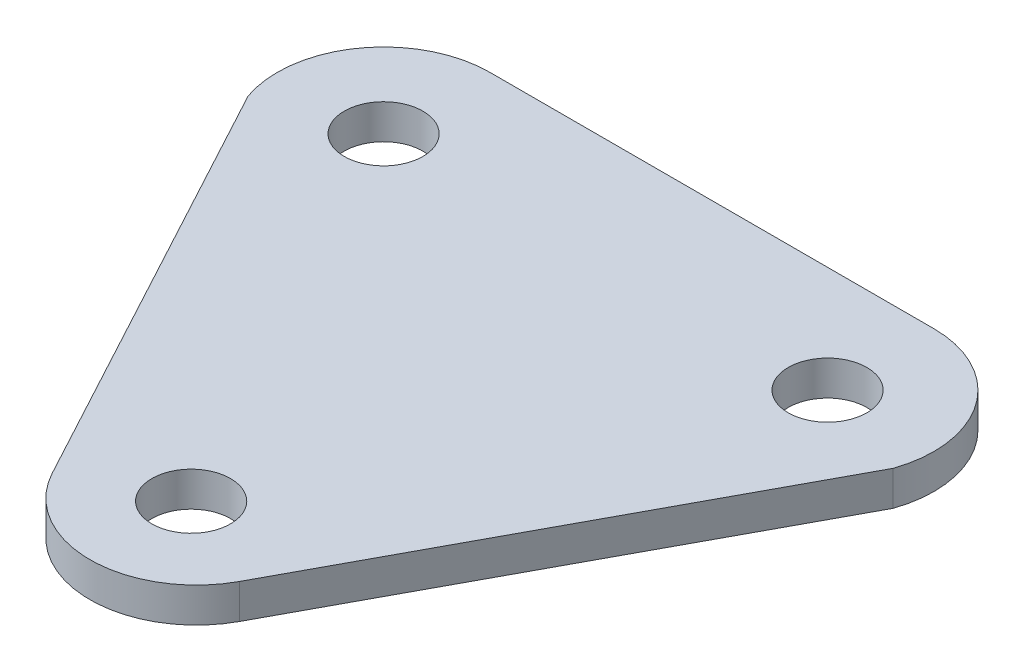
ISO-10303-21;
HEADER;
FILE_DESCRIPTION(('STEP AP214'),'2;1');
FILE_NAME('part.step','',(''),(''),'','','');
FILE_SCHEMA(('AUTOMOTIVE_DESIGN { 1 0 10303 214 1 1 1 1 }'));
ENDSEC;
DATA;
#1=APPLICATION_CONTEXT('core data for automotive mechanical design processes');
#2=APPLICATION_PROTOCOL_DEFINITION('international standard','automotive_design',2000,#1);
#3=PRODUCT_CONTEXT('',#1,'mechanical');
#4=PRODUCT('Part','Part','',(#3));
#5=PRODUCT_RELATED_PRODUCT_CATEGORY('part','',(#4));
#6=PRODUCT_DEFINITION_FORMATION('','',#4);
#7=PRODUCT_DEFINITION_CONTEXT('part definition',#1,'design');
#8=PRODUCT_DEFINITION('design','',#6,#7);
#9=PRODUCT_DEFINITION_SHAPE('','',#8);
#10=(LENGTH_UNIT() NAMED_UNIT(*) SI_UNIT(.MILLI.,.METRE.));
#11=(NAMED_UNIT(*) PLANE_ANGLE_UNIT() SI_UNIT($,.RADIAN.));
#12=(NAMED_UNIT(*) SI_UNIT($,.STERADIAN.) SOLID_ANGLE_UNIT());
#13=UNCERTAINTY_MEASURE_WITH_UNIT(LENGTH_MEASURE(1.E-05),#10,'distance_accuracy_value','');
#14=(GEOMETRIC_REPRESENTATION_CONTEXT(3) GLOBAL_UNCERTAINTY_ASSIGNED_CONTEXT((#13)) GLOBAL_UNIT_ASSIGNED_CONTEXT((#10,
#11,#12)) REPRESENTATION_CONTEXT('',''));
#15=CARTESIAN_POINT('',(0.,0.,0.));
#16=DIRECTION('',(0.,0.,1.));
#17=DIRECTION('',(1.,0.,0.));
#18=AXIS2_PLACEMENT_3D('',#15,#16,#17);
#19=CARTESIAN_POINT('',(0.,7.5,-61.0594186176359));
#20=DIRECTION('',(0.,0.,-1.));
#21=DIRECTION('',(-1.,0.,0.));
#22=AXIS2_PLACEMENT_3D('',#19,#20,#21);
#23=PLANE('',#22);
#24=DIRECTION('',(1.,0.,0.));
#25=VECTOR('',#24,1.);
#26=CARTESIAN_POINT('',(0.,0.,-61.0594186176359));
#27=LINE('',#26,#25);
#28=CARTESIAN_POINT('',(-48.0000000000001,0.,-61.0594186176359));
#29=VERTEX_POINT('',#28);
#30=CARTESIAN_POINT('',(48.,0.,-61.059418617636));
#31=VERTEX_POINT('',#30);
#32=EDGE_CURVE('E145',#29,#31,#27,.T.);
#33=ORIENTED_EDGE('',*,*,#32,.F.);
#34=DIRECTION('',(0.,-1.,0.));
#35=VECTOR('',#34,1.);
#36=CARTESIAN_POINT('',(-48.0000000000001,7.5,-61.0594186176359));
#37=LINE('',#36,#35);
#38=CARTESIAN_POINT('',(-48.0000000000001,7.5,-61.0594186176359));
#39=VERTEX_POINT('',#38);
#40=EDGE_CURVE('E11',#39,#29,#37,.T.);
#41=ORIENTED_EDGE('',*,*,#40,.F.);
#42=DIRECTION('',(1.,0.,0.));
#43=VECTOR('',#42,1.);
#44=CARTESIAN_POINT('',(0.,7.5,-61.0594186176359));
#45=LINE('',#44,#43);
#46=CARTESIAN_POINT('',(48.,7.5,-61.059418617636));
#47=VERTEX_POINT('',#46);
#48=EDGE_CURVE('E323',#39,#47,#45,.T.);
#49=ORIENTED_EDGE('',*,*,#48,.T.);
#50=DIRECTION('',(0.,-1.,0.));
#51=VECTOR('',#50,1.);
#52=CARTESIAN_POINT('',(48.,7.5,-61.059418617636));
#53=LINE('',#52,#51);
#54=EDGE_CURVE('E63',#47,#31,#53,.T.);
#55=ORIENTED_EDGE('',*,*,#54,.T.);
#56=EDGE_LOOP('',(#33,#41,#49,#55));
#57=FACE_BOUND('',#56,.T.);
#58=ADVANCED_FACE('F45',(#57),#23,.T.);
#59=CARTESIAN_POINT('',(-48.,7.5,-38.0594186176359));
#60=DIRECTION('',(0.,-1.,0.));
#61=DIRECTION('',(0.,0.,-1.));
#62=AXIS2_PLACEMENT_3D('',#59,#60,#61);
#63=CYLINDRICAL_SURFACE('',#62,23.);
#64=CARTESIAN_POINT('',(-48.,0.,-38.0594186176359));
#65=DIRECTION('',(0.,1.,0.));
#66=DIRECTION('',(0.,0.,1.));
#67=AXIS2_PLACEMENT_3D('',#64,#65,#66);
#68=CIRCLE('',#67,23.);
#69=CARTESIAN_POINT('',(-69.7230420316021,0.,-30.5023394931824));
#70=VERTEX_POINT('',#69);
#71=EDGE_CURVE('E148',#29,#70,#68,.T.);
#72=ORIENTED_EDGE('',*,*,#71,.T.);
#73=DIRECTION('',(0.,-1.,0.));
#74=VECTOR('',#73,1.);
#75=CARTESIAN_POINT('',(-69.7230420316021,7.5,-30.5023394931824));
#76=LINE('',#75,#74);
#77=CARTESIAN_POINT('',(-69.7230420316021,7.5,-30.5023394931824));
#78=VERTEX_POINT('',#77);
#79=EDGE_CURVE('E55',#78,#70,#76,.T.);
#80=ORIENTED_EDGE('',*,*,#79,.F.);
#81=CARTESIAN_POINT('',(-48.,7.5,-38.0594186176359));
#82=DIRECTION('',(0.,1.,0.));
#83=DIRECTION('',(0.,0.,1.));
#84=AXIS2_PLACEMENT_3D('',#81,#82,#83);
#85=CIRCLE('',#84,23.);
#86=EDGE_CURVE('E327',#39,#78,#85,.T.);
#87=ORIENTED_EDGE('',*,*,#86,.F.);
#88=ORIENTED_EDGE('',*,*,#40,.T.);
#89=EDGE_LOOP('',(#72,#80,#87,#88));
#90=FACE_BOUND('',#89,.T.);
#91=ADVANCED_FACE('F182',(#90),#63,.T.);
#92=CARTESIAN_POINT('',(-41.308585094542,7.5,22.2502861043366));
#93=DIRECTION('',(0.880407019554408,0.,-0.474218810170289));
#94=DIRECTION('',(-0.474218810170289,0.,-0.880407019554408));
#95=AXIS2_PLACEMENT_3D('',#92,#93,#94);
#96=PLANE('',#95);
#97=DIRECTION('',(0.474218810170289,0.,0.880407019554408));
#98=VECTOR('',#97,1.);
#99=CARTESIAN_POINT('',(-41.308585094542,0.,22.2502861043366));
#100=LINE('',#99,#98);
#101=CARTESIAN_POINT('',(-20.2493614497514,0.,61.3476140162807));
#102=VERTEX_POINT('',#101);
#103=EDGE_CURVE('E152',#70,#102,#100,.T.);
#104=ORIENTED_EDGE('',*,*,#103,.T.);
#105=DIRECTION('',(0.,-1.,0.));
#106=VECTOR('',#105,1.);
#107=CARTESIAN_POINT('',(-20.2493614497514,7.5,61.3476140162807));
#108=LINE('',#107,#106);
#109=CARTESIAN_POINT('',(-20.2493614497514,7.5,61.3476140162807));
#110=VERTEX_POINT('',#109);
#111=EDGE_CURVE('E111',#110,#102,#108,.T.);
#112=ORIENTED_EDGE('',*,*,#111,.F.);
#113=DIRECTION('',(0.474218810170289,0.,0.880407019554408));
#114=VECTOR('',#113,1.);
#115=CARTESIAN_POINT('',(-41.308585094542,7.5,22.2502861043366));
#116=LINE('',#115,#114);
#117=EDGE_CURVE('E121',#78,#110,#116,.T.);
#118=ORIENTED_EDGE('',*,*,#117,.F.);
#119=ORIENTED_EDGE('',*,*,#79,.T.);
#120=EDGE_LOOP('',(#104,#112,#118,#119));
#121=FACE_BOUND('',#120,.T.);
#122=ADVANCED_FACE('F179',(#121),#96,.F.);
#123=CARTESIAN_POINT('',(0.,7.5,50.440581382364));
#124=DIRECTION('',(0.,-1.,0.));
#125=DIRECTION('',(0.,0.,-1.));
#126=AXIS2_PLACEMENT_3D('',#123,#124,#125);
#127=CYLINDRICAL_SURFACE('',#126,23.);
#128=CARTESIAN_POINT('',(0.,0.,50.440581382364));
#129=DIRECTION('',(0.,1.,0.));
#130=DIRECTION('',(0.,0.,1.));
#131=AXIS2_PLACEMENT_3D('',#128,#129,#130);
#132=CIRCLE('',#131,23.);
#133=CARTESIAN_POINT('',(20.2493614497514,0.,61.3476140162807));
#134=VERTEX_POINT('',#133);
#135=EDGE_CURVE('E106',#134,#102,#132,.F.);
#136=ORIENTED_EDGE('',*,*,#135,.F.);
#137=DIRECTION('',(0.,-1.,0.));
#138=VECTOR('',#137,1.);
#139=CARTESIAN_POINT('',(20.2493614497514,7.5,61.3476140162807));
#140=LINE('',#139,#138);
#141=CARTESIAN_POINT('',(20.2493614497514,7.5,61.3476140162807));
#142=VERTEX_POINT('',#141);
#143=EDGE_CURVE('E101',#142,#134,#140,.T.);
#144=ORIENTED_EDGE('',*,*,#143,.F.);
#145=CARTESIAN_POINT('',(0.,7.5,50.440581382364));
#146=DIRECTION('',(0.,1.,0.));
#147=DIRECTION('',(0.,0.,1.));
#148=AXIS2_PLACEMENT_3D('',#145,#146,#147);
#149=CIRCLE('',#148,23.);
#150=EDGE_CURVE('E104',#142,#110,#149,.F.);
#151=ORIENTED_EDGE('',*,*,#150,.T.);
#152=ORIENTED_EDGE('',*,*,#111,.T.);
#153=EDGE_LOOP('',(#136,#144,#151,#152));
#154=FACE_BOUND('',#153,.T.);
#155=ADVANCED_FACE('F103',(#154),#127,.T.);
#156=CARTESIAN_POINT('',(41.3085850945419,7.5,22.2502861043365));
#157=DIRECTION('',(0.880407019554408,0.,0.474218810170289));
#158=DIRECTION('',(0.474218810170289,0.,-0.880407019554408));
#159=AXIS2_PLACEMENT_3D('',#156,#157,#158);
#160=PLANE('',#159);
#161=DIRECTION('',(-0.474218810170289,0.,0.880407019554408));
#162=VECTOR('',#161,1.);
#163=CARTESIAN_POINT('',(41.3085850945419,0.,22.2502861043365));
#164=LINE('',#163,#162);
#165=CARTESIAN_POINT('',(69.723042031602,0.,-30.5023394931824));
#166=VERTEX_POINT('',#165);
#167=EDGE_CURVE('E158',#166,#134,#164,.T.);
#168=ORIENTED_EDGE('',*,*,#167,.F.);
#169=DIRECTION('',(0.,-1.,0.));
#170=VECTOR('',#169,1.);
#171=CARTESIAN_POINT('',(69.723042031602,7.5,-30.5023394931824));
#172=LINE('',#171,#170);
#173=CARTESIAN_POINT('',(69.723042031602,7.5,-30.5023394931824));
#174=VERTEX_POINT('',#173);
#175=EDGE_CURVE('E82',#174,#166,#172,.T.);
#176=ORIENTED_EDGE('',*,*,#175,.F.);
#177=DIRECTION('',(-0.474218810170289,0.,0.880407019554408));
#178=VECTOR('',#177,1.);
#179=CARTESIAN_POINT('',(41.3085850945419,7.5,22.2502861043365));
#180=LINE('',#179,#178);
#181=EDGE_CURVE('E119',#174,#142,#180,.T.);
#182=ORIENTED_EDGE('',*,*,#181,.T.);
#183=ORIENTED_EDGE('',*,*,#143,.T.);
#184=EDGE_LOOP('',(#168,#176,#182,#183));
#185=FACE_BOUND('',#184,.T.);
#186=ADVANCED_FACE('F125',(#185),#160,.T.);
#187=CARTESIAN_POINT('',(48.,7.5,-38.059418617636));
#188=DIRECTION('',(0.,-1.,0.));
#189=DIRECTION('',(0.,0.,-1.));
#190=AXIS2_PLACEMENT_3D('',#187,#188,#189);
#191=CYLINDRICAL_SURFACE('',#190,23.);
#192=CARTESIAN_POINT('',(48.,0.,-38.059418617636));
#193=DIRECTION('',(0.,1.,0.));
#194=DIRECTION('',(0.,0.,1.));
#195=AXIS2_PLACEMENT_3D('',#192,#193,#194);
#196=CIRCLE('',#195,23.);
#197=EDGE_CURVE('E161',#31,#166,#196,.F.);
#198=ORIENTED_EDGE('',*,*,#197,.F.);
#199=ORIENTED_EDGE('',*,*,#54,.F.);
#200=CARTESIAN_POINT('',(48.,7.5,-38.059418617636));
#201=DIRECTION('',(0.,1.,0.));
#202=DIRECTION('',(0.,0.,1.));
#203=AXIS2_PLACEMENT_3D('',#200,#201,#202);
#204=CIRCLE('',#203,23.);
#205=EDGE_CURVE('E127',#47,#174,#204,.F.);
#206=ORIENTED_EDGE('',*,*,#205,.T.);
#207=ORIENTED_EDGE('',*,*,#175,.T.);
#208=EDGE_LOOP('',(#198,#199,#206,#207));
#209=FACE_BOUND('',#208,.T.);
#210=ADVANCED_FACE('F195',(#209),#191,.T.);
#211=CARTESIAN_POINT('',(-48.,7.5,-38.0594186176359));
#212=DIRECTION('',(0.,-1.,0.));
#213=DIRECTION('',(0.,0.,-1.));
#214=AXIS2_PLACEMENT_3D('',#211,#212,#213);
#215=CYLINDRICAL_SURFACE('',#214,8.5);
#216=CARTESIAN_POINT('',(-48.,7.5,-38.0594186176359));
#217=DIRECTION('',(0.,1.,0.));
#218=DIRECTION('',(0.,0.,1.));
#219=AXIS2_PLACEMENT_3D('',#216,#217,#218);
#220=CIRCLE('',#219,8.5);
#221=CARTESIAN_POINT('',(-48.,7.5,-29.5594186176359));
#222=VERTEX_POINT('',#221);
#223=EDGE_CURVE('E207',#222,#222,#220,.F.);
#224=ORIENTED_EDGE('',*,*,#223,.F.);
#225=EDGE_LOOP('',(#224));
#226=FACE_BOUND('',#225,.T.);
#227=CARTESIAN_POINT('',(-48.,0.,-38.0594186176359));
#228=DIRECTION('',(0.,1.,0.));
#229=DIRECTION('',(0.,0.,1.));
#230=AXIS2_PLACEMENT_3D('',#227,#228,#229);
#231=CIRCLE('',#230,8.5);
#232=CARTESIAN_POINT('',(-48.,0.,-29.5594186176359));
#233=VERTEX_POINT('',#232);
#234=EDGE_CURVE('E141',#233,#233,#231,.F.);
#235=ORIENTED_EDGE('',*,*,#234,.T.);
#236=EDGE_LOOP('',(#235));
#237=FACE_BOUND('',#236,.T.);
#238=ADVANCED_FACE('F193',(#226,#237),#215,.F.);
#239=CARTESIAN_POINT('',(0.,7.5,51.5404536243352));
#240=DIRECTION('',(0.,-1.,0.));
#241=DIRECTION('',(0.,0.,-1.));
#242=AXIS2_PLACEMENT_3D('',#239,#240,#241);
#243=CYLINDRICAL_SURFACE('',#242,8.5);
#244=CARTESIAN_POINT('',(0.,7.5,51.5404536243352));
#245=DIRECTION('',(0.,1.,0.));
#246=DIRECTION('',(0.,0.,1.));
#247=AXIS2_PLACEMENT_3D('',#244,#245,#246);
#248=CIRCLE('',#247,8.5);
#249=CARTESIAN_POINT('',(0.,7.5,60.0404536243352));
#250=VERTEX_POINT('',#249);
#251=EDGE_CURVE('E169',#250,#250,#248,.T.);
#252=ORIENTED_EDGE('',*,*,#251,.T.);
#253=EDGE_LOOP('',(#252));
#254=FACE_BOUND('',#253,.T.);
#255=CARTESIAN_POINT('',(0.,0.,51.5404536243352));
#256=DIRECTION('',(0.,1.,0.));
#257=DIRECTION('',(0.,0.,1.));
#258=AXIS2_PLACEMENT_3D('',#255,#256,#257);
#259=CIRCLE('',#258,8.5);
#260=CARTESIAN_POINT('',(0.,0.,60.0404536243352));
#261=VERTEX_POINT('',#260);
#262=EDGE_CURVE('E137',#261,#261,#259,.T.);
#263=ORIENTED_EDGE('',*,*,#262,.F.);
#264=EDGE_LOOP('',(#263));
#265=FACE_BOUND('',#264,.T.);
#266=ADVANCED_FACE('F47',(#254,#265),#243,.F.);
#267=CARTESIAN_POINT('',(48.,7.5,-38.059418617636));
#268=DIRECTION('',(0.,-1.,0.));
#269=DIRECTION('',(0.,0.,-1.));
#270=AXIS2_PLACEMENT_3D('',#267,#268,#269);
#271=CYLINDRICAL_SURFACE('',#270,8.5);
#272=CARTESIAN_POINT('',(48.,7.5,-38.059418617636));
#273=DIRECTION('',(0.,1.,0.));
#274=DIRECTION('',(0.,0.,1.));
#275=AXIS2_PLACEMENT_3D('',#272,#273,#274);
#276=CIRCLE('',#275,8.5);
#277=CARTESIAN_POINT('',(48.,7.5,-29.559418617636));
#278=VERTEX_POINT('',#277);
#279=EDGE_CURVE('E130',#278,#278,#276,.T.);
#280=ORIENTED_EDGE('',*,*,#279,.T.);
#281=EDGE_LOOP('',(#280));
#282=FACE_BOUND('',#281,.T.);
#283=CARTESIAN_POINT('',(48.,0.,-38.059418617636));
#284=DIRECTION('',(0.,1.,0.));
#285=DIRECTION('',(0.,0.,1.));
#286=AXIS2_PLACEMENT_3D('',#283,#284,#285);
#287=CIRCLE('',#286,8.5);
#288=CARTESIAN_POINT('',(48.,0.,-29.559418617636));
#289=VERTEX_POINT('',#288);
#290=EDGE_CURVE('E165',#289,#289,#287,.T.);
#291=ORIENTED_EDGE('',*,*,#290,.F.);
#292=EDGE_LOOP('',(#291));
#293=FACE_BOUND('',#292,.T.);
#294=ADVANCED_FACE('F201',(#282,#293),#271,.F.);
#295=CARTESIAN_POINT('',(0.,7.5,0.));
#296=DIRECTION('',(0.,1.,0.));
#297=DIRECTION('',(0.,0.,1.));
#298=AXIS2_PLACEMENT_3D('',#295,#296,#297);
#299=PLANE('',#298);
#300=ORIENTED_EDGE('',*,*,#251,.F.);
#301=EDGE_LOOP('',(#300));
#302=FACE_BOUND('',#301,.T.);
#303=ORIENTED_EDGE('',*,*,#223,.T.);
#304=EDGE_LOOP('',(#303));
#305=FACE_BOUND('',#304,.T.);
#306=ORIENTED_EDGE('',*,*,#48,.F.);
#307=ORIENTED_EDGE('',*,*,#86,.T.);
#308=ORIENTED_EDGE('',*,*,#117,.T.);
#309=ORIENTED_EDGE('',*,*,#150,.F.);
#310=ORIENTED_EDGE('',*,*,#181,.F.);
#311=ORIENTED_EDGE('',*,*,#205,.F.);
#312=EDGE_LOOP('',(#306,#307,#308,#309,#310,#311));
#313=FACE_BOUND('',#312,.T.);
#314=ORIENTED_EDGE('',*,*,#279,.F.);
#315=EDGE_LOOP('',(#314));
#316=FACE_BOUND('',#315,.T.);
#317=ADVANCED_FACE('F116',(#302,#305,#313,#316),#299,.T.);
#318=CARTESIAN_POINT('',(0.,0.,0.));
#319=DIRECTION('',(0.,1.,0.));
#320=DIRECTION('',(0.,0.,1.));
#321=AXIS2_PLACEMENT_3D('',#318,#319,#320);
#322=PLANE('',#321);
#323=ORIENTED_EDGE('',*,*,#262,.T.);
#324=EDGE_LOOP('',(#323));
#325=FACE_BOUND('',#324,.T.);
#326=ORIENTED_EDGE('',*,*,#234,.F.);
#327=EDGE_LOOP('',(#326));
#328=FACE_BOUND('',#327,.T.);
#329=ORIENTED_EDGE('',*,*,#32,.T.);
#330=ORIENTED_EDGE('',*,*,#197,.T.);
#331=ORIENTED_EDGE('',*,*,#167,.T.);
#332=ORIENTED_EDGE('',*,*,#135,.T.);
#333=ORIENTED_EDGE('',*,*,#103,.F.);
#334=ORIENTED_EDGE('',*,*,#71,.F.);
#335=EDGE_LOOP('',(#329,#330,#331,#332,#333,#334));
#336=FACE_BOUND('',#335,.T.);
#337=ORIENTED_EDGE('',*,*,#290,.T.);
#338=EDGE_LOOP('',(#337));
#339=FACE_BOUND('',#338,.T.);
#340=ADVANCED_FACE('F184',(#325,#328,#336,#339),#322,.F.);
#341=CLOSED_SHELL('',(#58,#91,#122,#155,#186,#210,#238,#266,#294,#317,#340));
#342=MANIFOLD_SOLID_BREP('B2',#341);
#343=ADVANCED_BREP_SHAPE_REPRESENTATION('',(#18,#342),#14);
#344=SHAPE_DEFINITION_REPRESENTATION(#9,#343);
ENDSEC;
END-ISO-10303-21;
